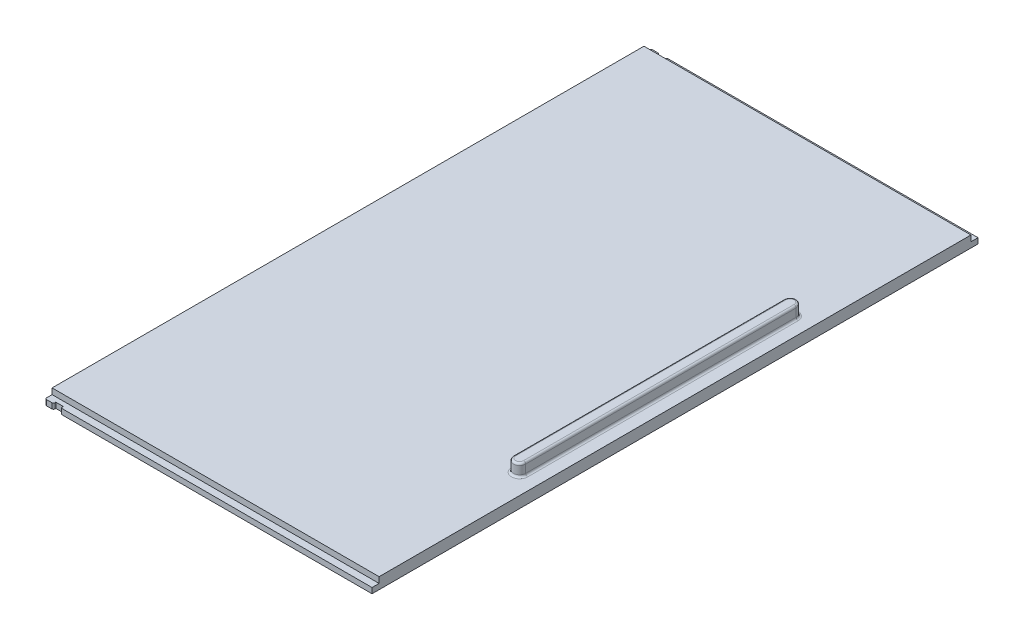
ISO-10303-21;
HEADER;
FILE_DESCRIPTION(('STEP AP214'),'2;1');
FILE_NAME('part.step','',(''),(''),'','','');
FILE_SCHEMA(('AUTOMOTIVE_DESIGN { 1 0 10303 214 1 1 1 1 }'));
ENDSEC;
DATA;
#1=APPLICATION_CONTEXT('core data for automotive mechanical design processes');
#2=APPLICATION_PROTOCOL_DEFINITION('international standard','automotive_design',2000,#1);
#3=PRODUCT_CONTEXT('',#1,'mechanical');
#4=PRODUCT('Part','Part','',(#3));
#5=PRODUCT_RELATED_PRODUCT_CATEGORY('part','',(#4));
#6=PRODUCT_DEFINITION_FORMATION('','',#4);
#7=PRODUCT_DEFINITION_CONTEXT('part definition',#1,'design');
#8=PRODUCT_DEFINITION('design','',#6,#7);
#9=PRODUCT_DEFINITION_SHAPE('','',#8);
#10=(LENGTH_UNIT() NAMED_UNIT(*) SI_UNIT(.MILLI.,.METRE.));
#11=(NAMED_UNIT(*) PLANE_ANGLE_UNIT() SI_UNIT($,.RADIAN.));
#12=(NAMED_UNIT(*) SI_UNIT($,.STERADIAN.) SOLID_ANGLE_UNIT());
#13=UNCERTAINTY_MEASURE_WITH_UNIT(LENGTH_MEASURE(1.E-05),#10,'distance_accuracy_value','');
#14=(GEOMETRIC_REPRESENTATION_CONTEXT(3) GLOBAL_UNCERTAINTY_ASSIGNED_CONTEXT((#13)) GLOBAL_UNIT_ASSIGNED_CONTEXT((#10,
#11,#12)) REPRESENTATION_CONTEXT('',''));
#15=CARTESIAN_POINT('',(0.,0.,0.));
#16=DIRECTION('',(0.,0.,1.));
#17=DIRECTION('',(1.,0.,0.));
#18=AXIS2_PLACEMENT_3D('',#15,#16,#17);
#19=CARTESIAN_POINT('',(0.,3.,0.));
#20=DIRECTION('',(0.,-1.,0.));
#21=DIRECTION('',(0.,0.,-1.));
#22=AXIS2_PLACEMENT_3D('',#19,#20,#21);
#23=PLANE('',#22);
#24=CARTESIAN_POINT('',(76.,3.,-43.));
#25=DIRECTION('',(0.,-1.,0.));
#26=DIRECTION('',(0.,0.,-1.));
#27=AXIS2_PLACEMENT_3D('',#24,#25,#26);
#28=CIRCLE('',#27,2.);
#29=CARTESIAN_POINT('',(78.,3.,-43.));
#30=VERTEX_POINT('',#29);
#31=CARTESIAN_POINT('',(74.,3.,-43.));
#32=VERTEX_POINT('',#31);
#33=EDGE_CURVE('E346',#30,#32,#28,.T.);
#34=ORIENTED_EDGE('',*,*,#33,.T.);
#35=DIRECTION('',(0.,0.,1.));
#36=VECTOR('',#35,1.);
#37=CARTESIAN_POINT('',(74.,3.,-110.));
#38=LINE('',#37,#36);
#39=CARTESIAN_POINT('',(74.,3.,-110.));
#40=VERTEX_POINT('',#39);
#41=EDGE_CURVE('E352',#32,#40,#38,.F.);
#42=ORIENTED_EDGE('',*,*,#41,.T.);
#43=CARTESIAN_POINT('',(76.,3.,-110.));
#44=DIRECTION('',(0.,-1.,0.));
#45=DIRECTION('',(0.,0.,-1.));
#46=AXIS2_PLACEMENT_3D('',#43,#44,#45);
#47=CIRCLE('',#46,2.);
#48=CARTESIAN_POINT('',(78.,3.,-110.));
#49=VERTEX_POINT('',#48);
#50=EDGE_CURVE('E350',#40,#49,#47,.T.);
#51=ORIENTED_EDGE('',*,*,#50,.T.);
#52=DIRECTION('',(0.,0.,-1.));
#53=VECTOR('',#52,1.);
#54=CARTESIAN_POINT('',(78.,3.,-43.));
#55=LINE('',#54,#53);
#56=EDGE_CURVE('E348',#49,#30,#55,.F.);
#57=ORIENTED_EDGE('',*,*,#56,.T.);
#58=EDGE_LOOP('',(#34,#42,#51,#57));
#59=FACE_BOUND('',#58,.T.);
#60=DIRECTION('',(0.,0.,1.));
#61=VECTOR('',#60,1.);
#62=CARTESIAN_POINT('',(0.,3.,0.));
#63=LINE('',#62,#61);
#64=CARTESIAN_POINT('',(0.,3.00000000000002,-149.8));
#65=VERTEX_POINT('',#64);
#66=CARTESIAN_POINT('',(0.,3.,-3.2));
#67=VERTEX_POINT('',#66);
#68=EDGE_CURVE('E284',#65,#67,#63,.T.);
#69=ORIENTED_EDGE('',*,*,#68,.T.);
#70=DIRECTION('',(1.,0.,0.));
#71=VECTOR('',#70,1.);
#72=CARTESIAN_POINT('',(-3.57805813256296,3.,-3.2));
#73=LINE('',#72,#71);
#74=CARTESIAN_POINT('',(81.,3.,-3.2));
#75=VERTEX_POINT('',#74);
#76=EDGE_CURVE('E469',#67,#75,#73,.T.);
#77=ORIENTED_EDGE('',*,*,#76,.T.);
#78=DIRECTION('',(0.,0.,-1.));
#79=VECTOR('',#78,1.);
#80=CARTESIAN_POINT('',(81.,3.,0.));
#81=LINE('',#80,#79);
#82=CARTESIAN_POINT('',(81.,3.00000000000002,-149.8));
#83=VERTEX_POINT('',#82);
#84=EDGE_CURVE('E287',#75,#83,#81,.T.);
#85=ORIENTED_EDGE('',*,*,#84,.T.);
#86=DIRECTION('',(1.,0.,0.));
#87=VECTOR('',#86,1.);
#88=CARTESIAN_POINT('',(-3.57805813256296,3.00000000000002,-149.8));
#89=LINE('',#88,#87);
#90=EDGE_CURVE('E267',#65,#83,#89,.T.);
#91=ORIENTED_EDGE('',*,*,#90,.F.);
#92=EDGE_LOOP('',(#69,#77,#85,#91));
#93=FACE_BOUND('',#92,.T.);
#94=ADVANCED_FACE('F41',(#59,#93),#23,.F.);
#95=CARTESIAN_POINT('',(-3.57805813256296,0.,-151.55));
#96=DIRECTION('',(0.,0.,1.));
#97=DIRECTION('',(1.,0.,0.));
#98=AXIS2_PLACEMENT_3D('',#95,#96,#97);
#99=PLANE('',#98);
#100=DIRECTION('',(1.,0.,0.));
#101=VECTOR('',#100,1.);
#102=CARTESIAN_POINT('',(0.,0.2,-151.55));
#103=LINE('',#102,#101);
#104=CARTESIAN_POINT('',(4.12500000000001,0.2,-151.55));
#105=VERTEX_POINT('',#104);
#106=CARTESIAN_POINT('',(81.,0.2,-151.55));
#107=VERTEX_POINT('',#106);
#108=EDGE_CURVE('E238',#105,#107,#103,.T.);
#109=ORIENTED_EDGE('',*,*,#108,.F.);
#110=DIRECTION('',(0.,1.,0.));
#111=VECTOR('',#110,1.);
#112=CARTESIAN_POINT('',(4.12500000000001,0.,-151.55));
#113=LINE('',#112,#111);
#114=CARTESIAN_POINT('',(4.12500000000001,1.55000000000002,-151.55));
#115=VERTEX_POINT('',#114);
#116=EDGE_CURVE('E317',#105,#115,#113,.T.);
#117=ORIENTED_EDGE('',*,*,#116,.T.);
#118=DIRECTION('',(1.,0.,0.));
#119=VECTOR('',#118,1.);
#120=CARTESIAN_POINT('',(-3.57805813256296,1.55000000000002,-151.55));
#121=LINE('',#120,#119);
#122=CARTESIAN_POINT('',(81.,1.55000000000002,-151.55));
#123=VERTEX_POINT('',#122);
#124=EDGE_CURVE('E264',#115,#123,#121,.T.);
#125=ORIENTED_EDGE('',*,*,#124,.T.);
#126=DIRECTION('',(0.,-1.,0.));
#127=VECTOR('',#126,1.);
#128=CARTESIAN_POINT('',(81.,0.,-151.55));
#129=LINE('',#128,#127);
#130=EDGE_CURVE('E257',#123,#107,#129,.T.);
#131=ORIENTED_EDGE('',*,*,#130,.T.);
#132=EDGE_LOOP('',(#109,#117,#125,#131));
#133=FACE_BOUND('',#132,.T.);
#134=ADVANCED_FACE('F262',(#133),#99,.F.);
#135=CARTESIAN_POINT('',(-3.57805813256296,0.,-1.45));
#136=DIRECTION('',(0.,0.,-1.));
#137=DIRECTION('',(0.,1.,0.));
#138=AXIS2_PLACEMENT_3D('',#135,#136,#137);
#139=PLANE('',#138);
#140=DIRECTION('',(-1.,0.,0.));
#141=VECTOR('',#140,1.);
#142=CARTESIAN_POINT('',(0.,0.2,-1.45));
#143=LINE('',#142,#141);
#144=CARTESIAN_POINT('',(81.,0.2,-1.45));
#145=VERTEX_POINT('',#144);
#146=CARTESIAN_POINT('',(4.125,0.2,-1.45));
#147=VERTEX_POINT('',#146);
#148=EDGE_CURVE('E416',#145,#147,#143,.T.);
#149=ORIENTED_EDGE('',*,*,#148,.F.);
#150=DIRECTION('',(0.,1.,0.));
#151=VECTOR('',#150,1.);
#152=CARTESIAN_POINT('',(81.,0.,-1.45));
#153=LINE('',#152,#151);
#154=CARTESIAN_POINT('',(81.,1.55,-1.45));
#155=VERTEX_POINT('',#154);
#156=EDGE_CURVE('E259',#145,#155,#153,.T.);
#157=ORIENTED_EDGE('',*,*,#156,.T.);
#158=DIRECTION('',(1.,0.,0.));
#159=VECTOR('',#158,1.);
#160=CARTESIAN_POINT('',(-3.57805813256296,1.55,-1.45));
#161=LINE('',#160,#159);
#162=CARTESIAN_POINT('',(4.125,1.55,-1.45));
#163=VERTEX_POINT('',#162);
#164=EDGE_CURVE('E477',#163,#155,#161,.T.);
#165=ORIENTED_EDGE('',*,*,#164,.F.);
#166=DIRECTION('',(0.,-1.,0.));
#167=VECTOR('',#166,1.);
#168=CARTESIAN_POINT('',(4.125,0.,-1.45));
#169=LINE('',#168,#167);
#170=EDGE_CURVE('E303',#163,#147,#169,.T.);
#171=ORIENTED_EDGE('',*,*,#170,.T.);
#172=EDGE_LOOP('',(#149,#157,#165,#171));
#173=FACE_BOUND('',#172,.T.);
#174=ADVANCED_FACE('F568',(#173),#139,.F.);
#175=CARTESIAN_POINT('',(0.,3.,0.));
#176=DIRECTION('',(1.,0.,0.));
#177=DIRECTION('',(0.,0.,-1.));
#178=AXIS2_PLACEMENT_3D('',#175,#176,#177);
#179=PLANE('',#178);
#180=DIRECTION('',(0.,0.,1.));
#181=VECTOR('',#180,1.);
#182=CARTESIAN_POINT('',(0.,1.55000000000002,-151.55));
#183=LINE('',#182,#181);
#184=CARTESIAN_POINT('',(0.,1.55000000000002,-151.15));
#185=VERTEX_POINT('',#184);
#186=CARTESIAN_POINT('',(0.,1.55000000000002,-149.8));
#187=VERTEX_POINT('',#186);
#188=EDGE_CURVE('E279',#185,#187,#183,.T.);
#189=ORIENTED_EDGE('',*,*,#188,.F.);
#190=DIRECTION('',(0.,1.,0.));
#191=VECTOR('',#190,1.);
#192=CARTESIAN_POINT('',(0.,3.,-151.15));
#193=LINE('',#192,#191);
#194=CARTESIAN_POINT('',(0.,0.2,-151.15));
#195=VERTEX_POINT('',#194);
#196=EDGE_CURVE('E329',#185,#195,#193,.F.);
#197=ORIENTED_EDGE('',*,*,#196,.T.);
#198=DIRECTION('',(0.,0.,-1.));
#199=VECTOR('',#198,1.);
#200=CARTESIAN_POINT('',(0.,0.2,-1.45));
#201=LINE('',#200,#199);
#202=CARTESIAN_POINT('',(0.,0.2,-1.85));
#203=VERTEX_POINT('',#202);
#204=EDGE_CURVE('E250',#203,#195,#201,.T.);
#205=ORIENTED_EDGE('',*,*,#204,.F.);
#206=DIRECTION('',(0.,-1.,0.));
#207=VECTOR('',#206,1.);
#208=CARTESIAN_POINT('',(0.,3.,-1.85));
#209=LINE('',#208,#207);
#210=CARTESIAN_POINT('',(0.,1.55,-1.85));
#211=VERTEX_POINT('',#210);
#212=EDGE_CURVE('E327',#203,#211,#209,.F.);
#213=ORIENTED_EDGE('',*,*,#212,.T.);
#214=DIRECTION('',(0.,0.,1.));
#215=VECTOR('',#214,1.);
#216=CARTESIAN_POINT('',(0.,1.55,-1.45));
#217=LINE('',#216,#215);
#218=CARTESIAN_POINT('',(0.,1.55,-3.2));
#219=VERTEX_POINT('',#218);
#220=EDGE_CURVE('E466',#219,#211,#217,.T.);
#221=ORIENTED_EDGE('',*,*,#220,.F.);
#222=DIRECTION('',(0.,-1.,0.));
#223=VECTOR('',#222,1.);
#224=CARTESIAN_POINT('',(0.,1.55,-3.2));
#225=LINE('',#224,#223);
#226=EDGE_CURVE('E288',#67,#219,#225,.T.);
#227=ORIENTED_EDGE('',*,*,#226,.F.);
#228=ORIENTED_EDGE('',*,*,#68,.F.);
#229=DIRECTION('',(0.,1.,0.));
#230=VECTOR('',#229,1.);
#231=CARTESIAN_POINT('',(0.,1.55000000000002,-149.8));
#232=LINE('',#231,#230);
#233=EDGE_CURVE('E281',#187,#65,#232,.T.);
#234=ORIENTED_EDGE('',*,*,#233,.F.);
#235=EDGE_LOOP('',(#189,#197,#205,#213,#221,#227,#228,#234));
#236=FACE_BOUND('',#235,.T.);
#237=ADVANCED_FACE('F527',(#236),#179,.F.);
#238=CARTESIAN_POINT('',(81.,3.,0.));
#239=DIRECTION('',(-1.,0.,0.));
#240=DIRECTION('',(0.,0.,1.));
#241=AXIS2_PLACEMENT_3D('',#238,#239,#240);
#242=PLANE('',#241);
#243=DIRECTION('',(0.,0.,1.));
#244=VECTOR('',#243,1.);
#245=CARTESIAN_POINT('',(81.,0.2,-1.45));
#246=LINE('',#245,#244);
#247=EDGE_CURVE('E242',#107,#145,#246,.T.);
#248=ORIENTED_EDGE('',*,*,#247,.F.);
#249=ORIENTED_EDGE('',*,*,#130,.F.);
#250=DIRECTION('',(0.,0.,-1.));
#251=VECTOR('',#250,1.);
#252=CARTESIAN_POINT('',(81.,1.55000000000002,-151.55));
#253=LINE('',#252,#251);
#254=CARTESIAN_POINT('',(81.,1.55000000000002,-149.8));
#255=VERTEX_POINT('',#254);
#256=EDGE_CURVE('E266',#255,#123,#253,.T.);
#257=ORIENTED_EDGE('',*,*,#256,.F.);
#258=DIRECTION('',(0.,-1.,0.));
#259=VECTOR('',#258,1.);
#260=CARTESIAN_POINT('',(81.,1.55000000000002,-149.8));
#261=LINE('',#260,#259);
#262=EDGE_CURVE('E269',#83,#255,#261,.T.);
#263=ORIENTED_EDGE('',*,*,#262,.F.);
#264=ORIENTED_EDGE('',*,*,#84,.F.);
#265=DIRECTION('',(0.,1.,0.));
#266=VECTOR('',#265,1.);
#267=CARTESIAN_POINT('',(81.,1.55,-3.2));
#268=LINE('',#267,#266);
#269=CARTESIAN_POINT('',(81.,1.55,-3.2));
#270=VERTEX_POINT('',#269);
#271=EDGE_CURVE('E475',#270,#75,#268,.T.);
#272=ORIENTED_EDGE('',*,*,#271,.F.);
#273=DIRECTION('',(0.,0.,-1.));
#274=VECTOR('',#273,1.);
#275=CARTESIAN_POINT('',(81.,1.55,-1.45));
#276=LINE('',#275,#274);
#277=EDGE_CURVE('E472',#155,#270,#276,.T.);
#278=ORIENTED_EDGE('',*,*,#277,.F.);
#279=ORIENTED_EDGE('',*,*,#156,.F.);
#280=EDGE_LOOP('',(#248,#249,#257,#263,#264,#272,#278,#279));
#281=FACE_BOUND('',#280,.T.);
#282=ADVANCED_FACE('F255',(#281),#242,.F.);
#283=CARTESIAN_POINT('',(0.4,0.2,-151.55));
#284=VERTEX_POINT('',#283);
#285=CARTESIAN_POINT('',(1.675,0.2,-151.55));
#286=VERTEX_POINT('',#285);
#287=EDGE_CURVE('E249',#284,#286,#103,.T.);
#288=ORIENTED_EDGE('',*,*,#287,.F.);
#289=DIRECTION('',(0.,1.,0.));
#290=VECTOR('',#289,1.);
#291=CARTESIAN_POINT('',(0.4,0.,-151.55));
#292=LINE('',#291,#290);
#293=CARTESIAN_POINT('',(0.4,1.55000000000002,-151.55));
#294=VERTEX_POINT('',#293);
#295=EDGE_CURVE('E322',#284,#294,#292,.T.);
#296=ORIENTED_EDGE('',*,*,#295,.T.);
#297=CARTESIAN_POINT('',(1.675,1.55000000000002,-151.55));
#298=VERTEX_POINT('',#297);
#299=EDGE_CURVE('E274',#294,#298,#121,.T.);
#300=ORIENTED_EDGE('',*,*,#299,.T.);
#301=DIRECTION('',(0.,1.,0.));
#302=VECTOR('',#301,1.);
#303=CARTESIAN_POINT('',(1.675,0.,-151.55));
#304=LINE('',#303,#302);
#305=EDGE_CURVE('E311',#298,#286,#304,.F.);
#306=ORIENTED_EDGE('',*,*,#305,.T.);
#307=EDGE_LOOP('',(#288,#296,#300,#306));
#308=FACE_BOUND('',#307,.T.);
#309=ADVANCED_FACE('F488',(#308),#99,.F.);
#310=CARTESIAN_POINT('',(0.4,1.55,-1.45));
#311=VERTEX_POINT('',#310);
#312=CARTESIAN_POINT('',(1.675,1.55,-1.45));
#313=VERTEX_POINT('',#312);
#314=EDGE_CURVE('E482',#311,#313,#161,.T.);
#315=ORIENTED_EDGE('',*,*,#314,.F.);
#316=DIRECTION('',(0.,-1.,0.));
#317=VECTOR('',#316,1.);
#318=CARTESIAN_POINT('',(0.4,0.,-1.45));
#319=LINE('',#318,#317);
#320=CARTESIAN_POINT('',(0.4,0.2,-1.45));
#321=VERTEX_POINT('',#320);
#322=EDGE_CURVE('E335',#311,#321,#319,.T.);
#323=ORIENTED_EDGE('',*,*,#322,.T.);
#324=CARTESIAN_POINT('',(1.675,0.2,-1.45));
#325=VERTEX_POINT('',#324);
#326=EDGE_CURVE('E260',#325,#321,#143,.T.);
#327=ORIENTED_EDGE('',*,*,#326,.F.);
#328=DIRECTION('',(0.,-1.,0.));
#329=VECTOR('',#328,1.);
#330=CARTESIAN_POINT('',(1.675,0.,-1.45));
#331=LINE('',#330,#329);
#332=EDGE_CURVE('E294',#325,#313,#331,.F.);
#333=ORIENTED_EDGE('',*,*,#332,.T.);
#334=EDGE_LOOP('',(#315,#323,#327,#333));
#335=FACE_BOUND('',#334,.T.);
#336=ADVANCED_FACE('F541',(#335),#139,.F.);
#337=CARTESIAN_POINT('',(3.925,0.,-2.05));
#338=DIRECTION('',(1.,0.,0.));
#339=DIRECTION('',(0.,0.,-1.));
#340=AXIS2_PLACEMENT_3D('',#337,#338,#339);
#341=PLANE('',#340);
#342=DIRECTION('',(0.,0.,-1.));
#343=VECTOR('',#342,1.);
#344=CARTESIAN_POINT('',(3.925,0.2,-2.05));
#345=LINE('',#344,#343);
#346=CARTESIAN_POINT('',(3.925,0.2,-1.64999999999999));
#347=VERTEX_POINT('',#346);
#348=CARTESIAN_POINT('',(3.925,0.2,-2.05));
#349=VERTEX_POINT('',#348);
#350=EDGE_CURVE('E430',#347,#349,#345,.T.);
#351=ORIENTED_EDGE('',*,*,#350,.F.);
#352=DIRECTION('',(0.,1.,0.));
#353=VECTOR('',#352,1.);
#354=CARTESIAN_POINT('',(3.925,0.,-1.64999999999999));
#355=LINE('',#354,#353);
#356=CARTESIAN_POINT('',(3.925,1.55,-1.64999999999999));
#357=VERTEX_POINT('',#356);
#358=EDGE_CURVE('E299',#347,#357,#355,.T.);
#359=ORIENTED_EDGE('',*,*,#358,.T.);
#360=DIRECTION('',(0.,0.,1.));
#361=VECTOR('',#360,1.);
#362=CARTESIAN_POINT('',(3.925,1.55,-2.05));
#363=LINE('',#362,#361);
#364=CARTESIAN_POINT('',(3.925,1.55,-2.05));
#365=VERTEX_POINT('',#364);
#366=EDGE_CURVE('E461',#365,#357,#363,.T.);
#367=ORIENTED_EDGE('',*,*,#366,.F.);
#368=DIRECTION('',(0.,1.,0.));
#369=VECTOR('',#368,1.);
#370=CARTESIAN_POINT('',(3.925,0.,-2.05));
#371=LINE('',#370,#369);
#372=EDGE_CURVE('E451',#349,#365,#371,.T.);
#373=ORIENTED_EDGE('',*,*,#372,.F.);
#374=EDGE_LOOP('',(#351,#359,#367,#373));
#375=FACE_BOUND('',#374,.T.);
#376=ADVANCED_FACE('F559',(#375),#341,.F.);
#377=CARTESIAN_POINT('',(2.075,0.,-2.05));
#378=DIRECTION('',(-1.,0.,0.));
#379=DIRECTION('',(0.,0.,1.));
#380=AXIS2_PLACEMENT_3D('',#377,#378,#379);
#381=PLANE('',#380);
#382=DIRECTION('',(0.,0.,1.));
#383=VECTOR('',#382,1.);
#384=CARTESIAN_POINT('',(2.075,0.2,-2.05));
#385=LINE('',#384,#383);
#386=CARTESIAN_POINT('',(2.075,0.2,-2.05));
#387=VERTEX_POINT('',#386);
#388=CARTESIAN_POINT('',(2.075,0.2,-1.85));
#389=VERTEX_POINT('',#388);
#390=EDGE_CURVE('E434',#387,#389,#385,.T.);
#391=ORIENTED_EDGE('',*,*,#390,.F.);
#392=DIRECTION('',(0.,-1.,0.));
#393=VECTOR('',#392,1.);
#394=CARTESIAN_POINT('',(2.075,0.,-2.05));
#395=LINE('',#394,#393);
#396=CARTESIAN_POINT('',(2.075,1.55,-2.05));
#397=VERTEX_POINT('',#396);
#398=EDGE_CURVE('E458',#397,#387,#395,.T.);
#399=ORIENTED_EDGE('',*,*,#398,.F.);
#400=DIRECTION('',(0.,0.,1.));
#401=VECTOR('',#400,1.);
#402=CARTESIAN_POINT('',(2.075,1.55,-2.05));
#403=LINE('',#402,#401);
#404=CARTESIAN_POINT('',(2.075,1.55,-1.85));
#405=VERTEX_POINT('',#404);
#406=EDGE_CURVE('E282',#397,#405,#403,.T.);
#407=ORIENTED_EDGE('',*,*,#406,.T.);
#408=DIRECTION('',(0.,-1.,0.));
#409=VECTOR('',#408,1.);
#410=CARTESIAN_POINT('',(2.075,0.,-1.85));
#411=LINE('',#410,#409);
#412=EDGE_CURVE('E291',#405,#389,#411,.T.);
#413=ORIENTED_EDGE('',*,*,#412,.T.);
#414=EDGE_LOOP('',(#391,#399,#407,#413));
#415=FACE_BOUND('',#414,.T.);
#416=ADVANCED_FACE('F549',(#415),#381,.F.);
#417=CARTESIAN_POINT('',(0.,0.,-2.05));
#418=DIRECTION('',(0.,0.,-1.));
#419=DIRECTION('',(-1.,0.,0.));
#420=AXIS2_PLACEMENT_3D('',#417,#418,#419);
#421=PLANE('',#420);
#422=DIRECTION('',(-1.,0.,0.));
#423=VECTOR('',#422,1.);
#424=CARTESIAN_POINT('',(0.,0.2,-2.05));
#425=LINE('',#424,#423);
#426=EDGE_CURVE('E432',#349,#387,#425,.T.);
#427=ORIENTED_EDGE('',*,*,#426,.F.);
#428=ORIENTED_EDGE('',*,*,#372,.T.);
#429=DIRECTION('',(-1.,0.,0.));
#430=VECTOR('',#429,1.);
#431=CARTESIAN_POINT('',(2.075,1.55,-2.05));
#432=LINE('',#431,#430);
#433=EDGE_CURVE('E455',#365,#397,#432,.T.);
#434=ORIENTED_EDGE('',*,*,#433,.T.);
#435=ORIENTED_EDGE('',*,*,#398,.T.);
#436=EDGE_LOOP('',(#427,#428,#434,#435));
#437=FACE_BOUND('',#436,.T.);
#438=ADVANCED_FACE('F555',(#437),#421,.F.);
#439=CARTESIAN_POINT('',(1.675,0.,-1.85));
#440=DIRECTION('',(0.,-1.,0.));
#441=DIRECTION('',(0.,0.,-1.));
#442=AXIS2_PLACEMENT_3D('',#439,#440,#441);
#443=CYLINDRICAL_SURFACE('',#442,0.4);
#444=ORIENTED_EDGE('',*,*,#332,.F.);
#445=CARTESIAN_POINT('',(1.675,0.2,-1.85));
#446=DIRECTION('',(0.,-1.,0.));
#447=DIRECTION('',(0.,0.,-1.));
#448=AXIS2_PLACEMENT_3D('',#445,#446,#447);
#449=CIRCLE('',#448,0.4);
#450=EDGE_CURVE('E436',#325,#389,#449,.F.);
#451=ORIENTED_EDGE('',*,*,#450,.T.);
#452=ORIENTED_EDGE('',*,*,#412,.F.);
#453=CARTESIAN_POINT('',(1.675,1.55,-1.85));
#454=DIRECTION('',(0.,-1.,0.));
#455=DIRECTION('',(0.,0.,-1.));
#456=AXIS2_PLACEMENT_3D('',#453,#454,#455);
#457=CIRCLE('',#456,0.4);
#458=EDGE_CURVE('E297',#313,#405,#457,.F.);
#459=ORIENTED_EDGE('',*,*,#458,.F.);
#460=EDGE_LOOP('',(#444,#451,#452,#459));
#461=FACE_BOUND('',#460,.T.);
#462=ADVANCED_FACE('F546',(#461),#443,.T.);
#463=CARTESIAN_POINT('',(3.925,0.,-1.64999999999999));
#464=DIRECTION('',(0.707106781186523,0.,-0.707106781186572));
#465=DIRECTION('',(0.,1.,0.));
#466=AXIS2_PLACEMENT_3D('',#463,#464,#465);
#467=PLANE('',#466);
#468=ORIENTED_EDGE('',*,*,#358,.F.);
#469=DIRECTION('',(-0.707106781186572,0.,-0.707106781186523));
#470=VECTOR('',#469,1.);
#471=CARTESIAN_POINT('',(3.925,0.2,-1.64999999999999));
#472=LINE('',#471,#470);
#473=EDGE_CURVE('E427',#347,#147,#472,.F.);
#474=ORIENTED_EDGE('',*,*,#473,.T.);
#475=ORIENTED_EDGE('',*,*,#170,.F.);
#476=DIRECTION('',(-0.707106781186572,0.,-0.707106781186523));
#477=VECTOR('',#476,1.);
#478=CARTESIAN_POINT('',(3.925,1.55,-1.64999999999999));
#479=LINE('',#478,#477);
#480=EDGE_CURVE('E301',#357,#163,#479,.F.);
#481=ORIENTED_EDGE('',*,*,#480,.F.);
#482=EDGE_LOOP('',(#468,#474,#475,#481));
#483=FACE_BOUND('',#482,.T.);
#484=ADVANCED_FACE('F564',(#483),#467,.F.);
#485=CARTESIAN_POINT('',(3.925,1.55,-150.95));
#486=DIRECTION('',(1.,0.,0.));
#487=DIRECTION('',(0.,0.,-1.));
#488=AXIS2_PLACEMENT_3D('',#485,#486,#487);
#489=PLANE('',#488);
#490=DIRECTION('',(0.,0.,-1.));
#491=VECTOR('',#490,1.);
#492=CARTESIAN_POINT('',(3.925,0.2,-150.95));
#493=LINE('',#492,#491);
#494=CARTESIAN_POINT('',(3.925,0.2,-150.95));
#495=VERTEX_POINT('',#494);
#496=CARTESIAN_POINT('',(3.925,0.2,-151.35));
#497=VERTEX_POINT('',#496);
#498=EDGE_CURVE('E418',#495,#497,#493,.T.);
#499=ORIENTED_EDGE('',*,*,#498,.F.);
#500=DIRECTION('',(0.,-1.,0.));
#501=VECTOR('',#500,1.);
#502=CARTESIAN_POINT('',(3.925,1.55,-150.95));
#503=LINE('',#502,#501);
#504=CARTESIAN_POINT('',(3.925,1.55,-150.95));
#505=VERTEX_POINT('',#504);
#506=EDGE_CURVE('E439',#505,#495,#503,.T.);
#507=ORIENTED_EDGE('',*,*,#506,.F.);
#508=DIRECTION('',(0.,0.,-1.));
#509=VECTOR('',#508,1.);
#510=CARTESIAN_POINT('',(3.925,1.55,-150.95));
#511=LINE('',#510,#509);
#512=CARTESIAN_POINT('',(3.925,1.55,-151.35));
#513=VERTEX_POINT('',#512);
#514=EDGE_CURVE('E448',#505,#513,#511,.T.);
#515=ORIENTED_EDGE('',*,*,#514,.T.);
#516=DIRECTION('',(0.,-1.,0.));
#517=VECTOR('',#516,1.);
#518=CARTESIAN_POINT('',(3.925,1.55,-151.35));
#519=LINE('',#518,#517);
#520=EDGE_CURVE('E314',#513,#497,#519,.T.);
#521=ORIENTED_EDGE('',*,*,#520,.T.);
#522=EDGE_LOOP('',(#499,#507,#515,#521));
#523=FACE_BOUND('',#522,.T.);
#524=ADVANCED_FACE('F508',(#523),#489,.F.);
#525=CARTESIAN_POINT('',(2.075,1.55,-150.95));
#526=DIRECTION('',(-1.,0.,0.));
#527=DIRECTION('',(0.,0.,1.));
#528=AXIS2_PLACEMENT_3D('',#525,#526,#527);
#529=PLANE('',#528);
#530=DIRECTION('',(0.,0.,1.));
#531=VECTOR('',#530,1.);
#532=CARTESIAN_POINT('',(2.075,0.2,-150.95));
#533=LINE('',#532,#531);
#534=CARTESIAN_POINT('',(2.075,0.2,-151.15));
#535=VERTEX_POINT('',#534);
#536=CARTESIAN_POINT('',(2.075,0.2,-150.95));
#537=VERTEX_POINT('',#536);
#538=EDGE_CURVE('E422',#535,#537,#533,.T.);
#539=ORIENTED_EDGE('',*,*,#538,.F.);
#540=DIRECTION('',(0.,1.,0.));
#541=VECTOR('',#540,1.);
#542=CARTESIAN_POINT('',(2.075,1.55,-151.15));
#543=LINE('',#542,#541);
#544=CARTESIAN_POINT('',(2.075,1.55,-151.15));
#545=VERTEX_POINT('',#544);
#546=EDGE_CURVE('E306',#535,#545,#543,.T.);
#547=ORIENTED_EDGE('',*,*,#546,.T.);
#548=DIRECTION('',(0.,0.,-1.));
#549=VECTOR('',#548,1.);
#550=CARTESIAN_POINT('',(2.075,1.55,-150.95));
#551=LINE('',#550,#549);
#552=CARTESIAN_POINT('',(2.075,1.55000000000002,-150.95));
#553=VERTEX_POINT('',#552);
#554=EDGE_CURVE('E447',#553,#545,#551,.T.);
#555=ORIENTED_EDGE('',*,*,#554,.F.);
#556=DIRECTION('',(0.,1.,0.));
#557=VECTOR('',#556,1.);
#558=CARTESIAN_POINT('',(2.075,1.55,-150.95));
#559=LINE('',#558,#557);
#560=EDGE_CURVE('E442',#537,#553,#559,.T.);
#561=ORIENTED_EDGE('',*,*,#560,.F.);
#562=EDGE_LOOP('',(#539,#547,#555,#561));
#563=FACE_BOUND('',#562,.T.);
#564=ADVANCED_FACE('F502',(#563),#529,.F.);
#565=CARTESIAN_POINT('',(0.,0.,-150.95));
#566=DIRECTION('',(0.,0.,1.));
#567=DIRECTION('',(1.,0.,0.));
#568=AXIS2_PLACEMENT_3D('',#565,#566,#567);
#569=PLANE('',#568);
#570=DIRECTION('',(1.,0.,0.));
#571=VECTOR('',#570,1.);
#572=CARTESIAN_POINT('',(0.,0.2,-150.95));
#573=LINE('',#572,#571);
#574=EDGE_CURVE('E420',#537,#495,#573,.T.);
#575=ORIENTED_EDGE('',*,*,#574,.F.);
#576=ORIENTED_EDGE('',*,*,#560,.T.);
#577=DIRECTION('',(1.,0.,0.));
#578=VECTOR('',#577,1.);
#579=CARTESIAN_POINT('',(2.075,1.55,-150.95));
#580=LINE('',#579,#578);
#581=EDGE_CURVE('E444',#553,#505,#580,.T.);
#582=ORIENTED_EDGE('',*,*,#581,.T.);
#583=ORIENTED_EDGE('',*,*,#506,.T.);
#584=EDGE_LOOP('',(#575,#576,#582,#583));
#585=FACE_BOUND('',#584,.T.);
#586=ADVANCED_FACE('F504',(#585),#569,.F.);
#587=CARTESIAN_POINT('',(1.675,1.55,-151.15));
#588=DIRECTION('',(0.,1.,0.));
#589=DIRECTION('',(0.,0.,1.));
#590=AXIS2_PLACEMENT_3D('',#587,#588,#589);
#591=CYLINDRICAL_SURFACE('',#590,0.4);
#592=ORIENTED_EDGE('',*,*,#546,.F.);
#593=CARTESIAN_POINT('',(1.675,0.2,-151.15));
#594=DIRECTION('',(0.,-1.,0.));
#595=DIRECTION('',(0.,0.,-1.));
#596=AXIS2_PLACEMENT_3D('',#593,#594,#595);
#597=CIRCLE('',#596,0.4);
#598=EDGE_CURVE('E424',#535,#286,#597,.F.);
#599=ORIENTED_EDGE('',*,*,#598,.T.);
#600=ORIENTED_EDGE('',*,*,#305,.F.);
#601=CARTESIAN_POINT('',(1.675,1.55000000000002,-151.15));
#602=DIRECTION('',(0.,-1.,0.));
#603=DIRECTION('',(0.,0.,-1.));
#604=AXIS2_PLACEMENT_3D('',#601,#602,#603);
#605=CIRCLE('',#604,0.4);
#606=EDGE_CURVE('E308',#545,#298,#605,.F.);
#607=ORIENTED_EDGE('',*,*,#606,.F.);
#608=EDGE_LOOP('',(#592,#599,#600,#607));
#609=FACE_BOUND('',#608,.T.);
#610=ADVANCED_FACE('F497',(#609),#591,.T.);
#611=CARTESIAN_POINT('',(3.925,1.55,-151.35));
#612=DIRECTION('',(0.707106781186548,0.,0.707106781186548));
#613=DIRECTION('',(0.,-1.,0.));
#614=AXIS2_PLACEMENT_3D('',#611,#612,#613);
#615=PLANE('',#614);
#616=ORIENTED_EDGE('',*,*,#116,.F.);
#617=DIRECTION('',(0.707106781186548,0.,-0.707106781186548));
#618=VECTOR('',#617,1.);
#619=CARTESIAN_POINT('',(3.925,0.2,-151.35));
#620=LINE('',#619,#618);
#621=EDGE_CURVE('E245',#105,#497,#620,.F.);
#622=ORIENTED_EDGE('',*,*,#621,.T.);
#623=ORIENTED_EDGE('',*,*,#520,.F.);
#624=DIRECTION('',(0.707106781186548,0.,-0.707106781186548));
#625=VECTOR('',#624,1.);
#626=CARTESIAN_POINT('',(3.925,1.55000000000002,-151.35));
#627=LINE('',#626,#625);
#628=EDGE_CURVE('E319',#115,#513,#627,.F.);
#629=ORIENTED_EDGE('',*,*,#628,.F.);
#630=EDGE_LOOP('',(#616,#622,#623,#629));
#631=FACE_BOUND('',#630,.T.);
#632=ADVANCED_FACE('F512',(#631),#615,.F.);
#633=CARTESIAN_POINT('',(-3.57805813256296,1.55000000000002,-151.55));
#634=DIRECTION('',(0.,-1.,0.));
#635=DIRECTION('',(0.,0.,-1.));
#636=AXIS2_PLACEMENT_3D('',#633,#634,#635);
#637=PLANE('',#636);
#638=ORIENTED_EDGE('',*,*,#299,.F.);
#639=CARTESIAN_POINT('',(0.4,1.55000000000002,-151.15));
#640=DIRECTION('',(0.,-1.,0.));
#641=DIRECTION('',(0.,0.,-1.));
#642=AXIS2_PLACEMENT_3D('',#639,#640,#641);
#643=CIRCLE('',#642,0.4);
#644=EDGE_CURVE('E325',#294,#185,#643,.F.);
#645=ORIENTED_EDGE('',*,*,#644,.T.);
#646=ORIENTED_EDGE('',*,*,#188,.T.);
#647=DIRECTION('',(1.,0.,0.));
#648=VECTOR('',#647,1.);
#649=CARTESIAN_POINT('',(-3.57805813256296,1.55000000000002,-149.8));
#650=LINE('',#649,#648);
#651=EDGE_CURVE('E271',#187,#255,#650,.T.);
#652=ORIENTED_EDGE('',*,*,#651,.T.);
#653=ORIENTED_EDGE('',*,*,#256,.T.);
#654=ORIENTED_EDGE('',*,*,#124,.F.);
#655=ORIENTED_EDGE('',*,*,#628,.T.);
#656=ORIENTED_EDGE('',*,*,#514,.F.);
#657=ORIENTED_EDGE('',*,*,#581,.F.);
#658=ORIENTED_EDGE('',*,*,#554,.T.);
#659=ORIENTED_EDGE('',*,*,#606,.T.);
#660=EDGE_LOOP('',(#638,#645,#646,#652,#653,#654,#655,#656,#657,#658,#659));
#661=FACE_BOUND('',#660,.T.);
#662=ADVANCED_FACE('F492',(#661),#637,.F.);
#663=CARTESIAN_POINT('',(-3.57805813256296,1.55000000000002,-149.8));
#664=DIRECTION('',(0.,0.,1.));
#665=DIRECTION('',(1.,0.,0.));
#666=AXIS2_PLACEMENT_3D('',#663,#664,#665);
#667=PLANE('',#666);
#668=ORIENTED_EDGE('',*,*,#233,.T.);
#669=ORIENTED_EDGE('',*,*,#90,.T.);
#670=ORIENTED_EDGE('',*,*,#262,.T.);
#671=ORIENTED_EDGE('',*,*,#651,.F.);
#672=EDGE_LOOP('',(#668,#669,#670,#671));
#673=FACE_BOUND('',#672,.T.);
#674=ADVANCED_FACE('F832',(#673),#667,.F.);
#675=CARTESIAN_POINT('',(-3.57805813256296,1.55,-3.2));
#676=DIRECTION('',(0.,0.,-1.));
#677=DIRECTION('',(-1.,0.,0.));
#678=AXIS2_PLACEMENT_3D('',#675,#676,#677);
#679=PLANE('',#678);
#680=ORIENTED_EDGE('',*,*,#226,.T.);
#681=DIRECTION('',(1.,0.,0.));
#682=VECTOR('',#681,1.);
#683=CARTESIAN_POINT('',(-3.57805813256296,1.55,-3.2));
#684=LINE('',#683,#682);
#685=EDGE_CURVE('E480',#219,#270,#684,.T.);
#686=ORIENTED_EDGE('',*,*,#685,.T.);
#687=ORIENTED_EDGE('',*,*,#271,.T.);
#688=ORIENTED_EDGE('',*,*,#76,.F.);
#689=EDGE_LOOP('',(#680,#686,#687,#688));
#690=FACE_BOUND('',#689,.T.);
#691=ADVANCED_FACE('F522',(#690),#679,.F.);
#692=CARTESIAN_POINT('',(-3.57805813256296,1.55,-1.45));
#693=DIRECTION('',(0.,-1.,0.));
#694=DIRECTION('',(0.,0.,-1.));
#695=AXIS2_PLACEMENT_3D('',#692,#693,#694);
#696=PLANE('',#695);
#697=ORIENTED_EDGE('',*,*,#220,.T.);
#698=CARTESIAN_POINT('',(0.4,1.55,-1.85));
#699=DIRECTION('',(0.,-1.,0.));
#700=DIRECTION('',(0.,0.,-1.));
#701=AXIS2_PLACEMENT_3D('',#698,#699,#700);
#702=CIRCLE('',#701,0.4);
#703=EDGE_CURVE('E338',#211,#311,#702,.F.);
#704=ORIENTED_EDGE('',*,*,#703,.T.);
#705=ORIENTED_EDGE('',*,*,#314,.T.);
#706=ORIENTED_EDGE('',*,*,#458,.T.);
#707=ORIENTED_EDGE('',*,*,#406,.F.);
#708=ORIENTED_EDGE('',*,*,#433,.F.);
#709=ORIENTED_EDGE('',*,*,#366,.T.);
#710=ORIENTED_EDGE('',*,*,#480,.T.);
#711=ORIENTED_EDGE('',*,*,#164,.T.);
#712=ORIENTED_EDGE('',*,*,#277,.T.);
#713=ORIENTED_EDGE('',*,*,#685,.F.);
#714=EDGE_LOOP('',(#697,#704,#705,#706,#707,#708,#709,#710,#711,#712,#713));
#715=FACE_BOUND('',#714,.T.);
#716=ADVANCED_FACE('F533',(#715),#696,.F.);
#717=CARTESIAN_POINT('',(0.,0.2,0.));
#718=DIRECTION('',(0.,-1.,0.));
#719=DIRECTION('',(0.,0.,-1.));
#720=AXIS2_PLACEMENT_3D('',#717,#718,#719);
#721=PLANE('',#720);
#722=ORIENTED_EDGE('',*,*,#204,.T.);
#723=CARTESIAN_POINT('',(0.4,0.2,-151.15));
#724=DIRECTION('',(0.,-1.,0.));
#725=DIRECTION('',(0.,0.,-1.));
#726=AXIS2_PLACEMENT_3D('',#723,#724,#725);
#727=CIRCLE('',#726,0.4);
#728=EDGE_CURVE('E333',#195,#284,#727,.T.);
#729=ORIENTED_EDGE('',*,*,#728,.T.);
#730=ORIENTED_EDGE('',*,*,#287,.T.);
#731=ORIENTED_EDGE('',*,*,#598,.F.);
#732=ORIENTED_EDGE('',*,*,#538,.T.);
#733=ORIENTED_EDGE('',*,*,#574,.T.);
#734=ORIENTED_EDGE('',*,*,#498,.T.);
#735=ORIENTED_EDGE('',*,*,#621,.F.);
#736=ORIENTED_EDGE('',*,*,#108,.T.);
#737=ORIENTED_EDGE('',*,*,#247,.T.);
#738=ORIENTED_EDGE('',*,*,#148,.T.);
#739=ORIENTED_EDGE('',*,*,#473,.F.);
#740=ORIENTED_EDGE('',*,*,#350,.T.);
#741=ORIENTED_EDGE('',*,*,#426,.T.);
#742=ORIENTED_EDGE('',*,*,#390,.T.);
#743=ORIENTED_EDGE('',*,*,#450,.F.);
#744=ORIENTED_EDGE('',*,*,#326,.T.);
#745=CARTESIAN_POINT('',(0.4,0.2,-1.85));
#746=DIRECTION('',(0.,-1.,0.));
#747=DIRECTION('',(0.,0.,-1.));
#748=AXIS2_PLACEMENT_3D('',#745,#746,#747);
#749=CIRCLE('',#748,0.4);
#750=EDGE_CURVE('E331',#321,#203,#749,.T.);
#751=ORIENTED_EDGE('',*,*,#750,.T.);
#752=EDGE_LOOP('',(#722,#729,#730,#731,#732,#733,#734,#735,#736,#737,#738,#739,#740,#741,#742,
#743,#744,#751));
#753=FACE_BOUND('',#752,.T.);
#754=ADVANCED_FACE('F241',(#753),#721,.T.);
#755=CARTESIAN_POINT('',(0.4,0.,-151.15));
#756=DIRECTION('',(0.,1.,0.));
#757=DIRECTION('',(0.,0.,1.));
#758=AXIS2_PLACEMENT_3D('',#755,#756,#757);
#759=CYLINDRICAL_SURFACE('',#758,0.4);
#760=ORIENTED_EDGE('',*,*,#728,.F.);
#761=ORIENTED_EDGE('',*,*,#196,.F.);
#762=ORIENTED_EDGE('',*,*,#644,.F.);
#763=ORIENTED_EDGE('',*,*,#295,.F.);
#764=EDGE_LOOP('',(#760,#761,#762,#763));
#765=FACE_BOUND('',#764,.T.);
#766=ADVANCED_FACE('F605',(#765),#759,.T.);
#767=CARTESIAN_POINT('',(0.4,0.,-1.85));
#768=DIRECTION('',(0.,-1.,0.));
#769=DIRECTION('',(0.,0.,-1.));
#770=AXIS2_PLACEMENT_3D('',#767,#768,#769);
#771=CYLINDRICAL_SURFACE('',#770,0.4);
#772=ORIENTED_EDGE('',*,*,#703,.F.);
#773=ORIENTED_EDGE('',*,*,#212,.F.);
#774=ORIENTED_EDGE('',*,*,#750,.F.);
#775=ORIENTED_EDGE('',*,*,#322,.F.);
#776=EDGE_LOOP('',(#772,#773,#774,#775));
#777=FACE_BOUND('',#776,.T.);
#778=ADVANCED_FACE('F537',(#777),#771,.T.);
#779=CARTESIAN_POINT('',(76.,6.,-43.));
#780=DIRECTION('',(0.,-1.,0.));
#781=DIRECTION('',(0.,0.,-1.));
#782=AXIS2_PLACEMENT_3D('',#779,#780,#781);
#783=CYLINDRICAL_SURFACE('',#782,1.5);
#784=DIRECTION('',(0.,-1.,0.));
#785=VECTOR('',#784,1.);
#786=CARTESIAN_POINT('',(77.5,6.,-43.));
#787=LINE('',#786,#785);
#788=CARTESIAN_POINT('',(77.5,5.5,-43.));
#789=VERTEX_POINT('',#788);
#790=CARTESIAN_POINT('',(77.5,3.5,-43.));
#791=VERTEX_POINT('',#790);
#792=EDGE_CURVE('E401',#789,#791,#787,.T.);
#793=ORIENTED_EDGE('',*,*,#792,.F.);
#794=CARTESIAN_POINT('',(76.,5.5,-43.));
#795=DIRECTION('',(0.,1.,0.));
#796=DIRECTION('',(0.,0.,1.));
#797=AXIS2_PLACEMENT_3D('',#794,#795,#796);
#798=CIRCLE('',#797,1.5);
#799=CARTESIAN_POINT('',(74.5,5.5,-43.));
#800=VERTEX_POINT('',#799);
#801=EDGE_CURVE('E11',#789,#800,#798,.F.);
#802=ORIENTED_EDGE('',*,*,#801,.T.);
#803=DIRECTION('',(0.,-1.,0.));
#804=VECTOR('',#803,1.);
#805=CARTESIAN_POINT('',(74.5,6.,-43.));
#806=LINE('',#805,#804);
#807=CARTESIAN_POINT('',(74.5,3.5,-43.));
#808=VERTEX_POINT('',#807);
#809=EDGE_CURVE('E380',#800,#808,#806,.T.);
#810=ORIENTED_EDGE('',*,*,#809,.T.);
#811=CARTESIAN_POINT('',(76.,3.5,-43.));
#812=DIRECTION('',(0.,-1.,0.));
#813=DIRECTION('',(0.,0.,-1.));
#814=AXIS2_PLACEMENT_3D('',#811,#812,#813);
#815=CIRCLE('',#814,1.5);
#816=EDGE_CURVE('E50',#808,#791,#815,.F.);
#817=ORIENTED_EDGE('',*,*,#816,.T.);
#818=EDGE_LOOP('',(#793,#802,#810,#817));
#819=FACE_BOUND('',#818,.T.);
#820=ADVANCED_FACE('F406',(#819),#783,.T.);
#821=CARTESIAN_POINT('',(77.5,6.,-43.));
#822=DIRECTION('',(-1.,0.,0.));
#823=DIRECTION('',(0.,0.,1.));
#824=AXIS2_PLACEMENT_3D('',#821,#822,#823);
#825=PLANE('',#824);
#826=ORIENTED_EDGE('',*,*,#792,.T.);
#827=DIRECTION('',(0.,0.,-1.));
#828=VECTOR('',#827,1.);
#829=CARTESIAN_POINT('',(77.5,3.5,-110.));
#830=LINE('',#829,#828);
#831=CARTESIAN_POINT('',(77.5,3.5,-110.));
#832=VERTEX_POINT('',#831);
#833=EDGE_CURVE('E361',#791,#832,#830,.T.);
#834=ORIENTED_EDGE('',*,*,#833,.T.);
#835=DIRECTION('',(0.,-1.,0.));
#836=VECTOR('',#835,1.);
#837=CARTESIAN_POINT('',(77.5,6.,-110.));
#838=LINE('',#837,#836);
#839=CARTESIAN_POINT('',(77.5,5.5,-110.));
#840=VERTEX_POINT('',#839);
#841=EDGE_CURVE('E404',#840,#832,#838,.T.);
#842=ORIENTED_EDGE('',*,*,#841,.F.);
#843=DIRECTION('',(0.,0.,-1.));
#844=VECTOR('',#843,1.);
#845=CARTESIAN_POINT('',(77.5,5.5,-43.));
#846=LINE('',#845,#844);
#847=EDGE_CURVE('E359',#840,#789,#846,.F.);
#848=ORIENTED_EDGE('',*,*,#847,.T.);
#849=EDGE_LOOP('',(#826,#834,#842,#848));
#850=FACE_BOUND('',#849,.T.);
#851=ADVANCED_FACE('F400',(#850),#825,.F.);
#852=CARTESIAN_POINT('',(76.,6.,-110.));
#853=DIRECTION('',(0.,-1.,0.));
#854=DIRECTION('',(0.,0.,-1.));
#855=AXIS2_PLACEMENT_3D('',#852,#853,#854);
#856=CYLINDRICAL_SURFACE('',#855,1.5);
#857=ORIENTED_EDGE('',*,*,#841,.T.);
#858=CARTESIAN_POINT('',(76.,3.5,-110.));
#859=DIRECTION('',(0.,-1.,0.));
#860=DIRECTION('',(0.,0.,-1.));
#861=AXIS2_PLACEMENT_3D('',#858,#859,#860);
#862=CIRCLE('',#861,1.5);
#863=CARTESIAN_POINT('',(74.5,3.5,-110.));
#864=VERTEX_POINT('',#863);
#865=EDGE_CURVE('E357',#832,#864,#862,.F.);
#866=ORIENTED_EDGE('',*,*,#865,.T.);
#867=DIRECTION('',(0.,-1.,0.));
#868=VECTOR('',#867,1.);
#869=CARTESIAN_POINT('',(74.5,6.,-110.));
#870=LINE('',#869,#868);
#871=CARTESIAN_POINT('',(74.5,5.5,-110.));
#872=VERTEX_POINT('',#871);
#873=EDGE_CURVE('E412',#872,#864,#870,.T.);
#874=ORIENTED_EDGE('',*,*,#873,.F.);
#875=CARTESIAN_POINT('',(76.,5.5,-110.));
#876=DIRECTION('',(0.,1.,0.));
#877=DIRECTION('',(0.,0.,1.));
#878=AXIS2_PLACEMENT_3D('',#875,#876,#877);
#879=CIRCLE('',#878,1.5);
#880=EDGE_CURVE('E355',#872,#840,#879,.F.);
#881=ORIENTED_EDGE('',*,*,#880,.T.);
#882=EDGE_LOOP('',(#857,#866,#874,#881));
#883=FACE_BOUND('',#882,.T.);
#884=ADVANCED_FACE('F674',(#883),#856,.T.);
#885=CARTESIAN_POINT('',(74.5,6.,-43.));
#886=DIRECTION('',(1.,0.,0.));
#887=DIRECTION('',(0.,0.,-1.));
#888=AXIS2_PLACEMENT_3D('',#885,#886,#887);
#889=PLANE('',#888);
#890=ORIENTED_EDGE('',*,*,#873,.T.);
#891=DIRECTION('',(0.,0.,1.));
#892=VECTOR('',#891,1.);
#893=CARTESIAN_POINT('',(74.5,3.5,-43.));
#894=LINE('',#893,#892);
#895=EDGE_CURVE('E343',#864,#808,#894,.T.);
#896=ORIENTED_EDGE('',*,*,#895,.T.);
#897=ORIENTED_EDGE('',*,*,#809,.F.);
#898=DIRECTION('',(0.,0.,1.));
#899=VECTOR('',#898,1.);
#900=CARTESIAN_POINT('',(74.5,5.5,-110.));
#901=LINE('',#900,#899);
#902=EDGE_CURVE('E340',#800,#872,#901,.F.);
#903=ORIENTED_EDGE('',*,*,#902,.T.);
#904=EDGE_LOOP('',(#890,#896,#897,#903));
#905=FACE_BOUND('',#904,.T.);
#906=ADVANCED_FACE('F666',(#905),#889,.F.);
#907=CARTESIAN_POINT('',(76.,6.,-43.));
#908=DIRECTION('',(0.,1.,0.));
#909=DIRECTION('',(0.,0.,1.));
#910=AXIS2_PLACEMENT_3D('',#907,#908,#909);
#911=PLANE('',#910);
#912=CARTESIAN_POINT('',(76.,6.,-110.));
#913=DIRECTION('',(0.,1.,0.));
#914=DIRECTION('',(0.,0.,1.));
#915=AXIS2_PLACEMENT_3D('',#912,#913,#914);
#916=CIRCLE('',#915,1.);
#917=CARTESIAN_POINT('',(77.,6.,-110.));
#918=VERTEX_POINT('',#917);
#919=CARTESIAN_POINT('',(75.,6.,-110.));
#920=VERTEX_POINT('',#919);
#921=EDGE_CURVE('E58',#918,#920,#916,.T.);
#922=ORIENTED_EDGE('',*,*,#921,.T.);
#923=DIRECTION('',(0.,0.,1.));
#924=VECTOR('',#923,1.);
#925=CARTESIAN_POINT('',(75.,6.,-43.));
#926=LINE('',#925,#924);
#927=CARTESIAN_POINT('',(75.,6.,-43.));
#928=VERTEX_POINT('',#927);
#929=EDGE_CURVE('E367',#920,#928,#926,.T.);
#930=ORIENTED_EDGE('',*,*,#929,.T.);
#931=CARTESIAN_POINT('',(76.,6.,-43.));
#932=DIRECTION('',(0.,1.,0.));
#933=DIRECTION('',(0.,0.,1.));
#934=AXIS2_PLACEMENT_3D('',#931,#932,#933);
#935=CIRCLE('',#934,1.);
#936=CARTESIAN_POINT('',(77.,6.,-43.));
#937=VERTEX_POINT('',#936);
#938=EDGE_CURVE('E363',#928,#937,#935,.T.);
#939=ORIENTED_EDGE('',*,*,#938,.T.);
#940=DIRECTION('',(0.,0.,-1.));
#941=VECTOR('',#940,1.);
#942=CARTESIAN_POINT('',(77.,6.,-110.));
#943=LINE('',#942,#941);
#944=EDGE_CURVE('E63',#937,#918,#943,.T.);
#945=ORIENTED_EDGE('',*,*,#944,.T.);
#946=EDGE_LOOP('',(#922,#930,#939,#945));
#947=FACE_BOUND('',#946,.T.);
#948=ADVANCED_FACE('F625',(#947),#911,.T.);
#949=CARTESIAN_POINT('',(78.,3.5,-43.));
#950=DIRECTION('',(0.,0.,1.));
#951=DIRECTION('',(1.,0.,0.));
#952=AXIS2_PLACEMENT_3D('',#949,#950,#951);
#953=CYLINDRICAL_SURFACE('',#952,0.5);
#954=CARTESIAN_POINT('',(78.,3.5,-43.));
#955=DIRECTION('',(0.,0.,-1.));
#956=DIRECTION('',(-1.,0.,0.));
#957=AXIS2_PLACEMENT_3D('',#954,#955,#956);
#958=CIRCLE('',#957,0.5);
#959=EDGE_CURVE('E374',#30,#791,#958,.T.);
#960=ORIENTED_EDGE('',*,*,#959,.F.);
#961=ORIENTED_EDGE('',*,*,#56,.F.);
#962=CARTESIAN_POINT('',(78.,3.5,-110.));
#963=DIRECTION('',(0.,0.,1.));
#964=DIRECTION('',(1.,0.,0.));
#965=AXIS2_PLACEMENT_3D('',#962,#963,#964);
#966=CIRCLE('',#965,0.5);
#967=EDGE_CURVE('E377',#832,#49,#966,.T.);
#968=ORIENTED_EDGE('',*,*,#967,.F.);
#969=ORIENTED_EDGE('',*,*,#833,.F.);
#970=EDGE_LOOP('',(#960,#961,#968,#969));
#971=FACE_BOUND('',#970,.T.);
#972=ADVANCED_FACE('F621',(#971),#953,.F.);
#973=CARTESIAN_POINT('',(76.,3.5,-110.));
#974=DIRECTION('',(0.,-1.,0.));
#975=DIRECTION('',(0.,0.,-1.));
#976=AXIS2_PLACEMENT_3D('',#973,#974,#975);
#977=TOROIDAL_SURFACE('',#976,2.,0.5);
#978=ORIENTED_EDGE('',*,*,#967,.T.);
#979=ORIENTED_EDGE('',*,*,#50,.F.);
#980=CARTESIAN_POINT('',(74.,3.5,-110.));
#981=DIRECTION('',(0.,0.,-1.));
#982=DIRECTION('',(-1.,0.,0.));
#983=AXIS2_PLACEMENT_3D('',#980,#981,#982);
#984=CIRCLE('',#983,0.5);
#985=EDGE_CURVE('E372',#864,#40,#984,.T.);
#986=ORIENTED_EDGE('',*,*,#985,.F.);
#987=ORIENTED_EDGE('',*,*,#865,.F.);
#988=EDGE_LOOP('',(#978,#979,#986,#987));
#989=FACE_BOUND('',#988,.T.);
#990=ADVANCED_FACE('F617',(#989),#977,.F.);
#991=CARTESIAN_POINT('',(76.,3.5,-43.));
#992=DIRECTION('',(0.,-1.,0.));
#993=DIRECTION('',(0.,0.,-1.));
#994=AXIS2_PLACEMENT_3D('',#991,#992,#993);
#995=TOROIDAL_SURFACE('',#994,2.,0.5);
#996=ORIENTED_EDGE('',*,*,#959,.T.);
#997=ORIENTED_EDGE('',*,*,#816,.F.);
#998=CARTESIAN_POINT('',(74.,3.5,-43.));
#999=DIRECTION('',(0.,0.,1.));
#1000=DIRECTION('',(1.,0.,0.));
#1001=AXIS2_PLACEMENT_3D('',#998,#999,#1000);
#1002=CIRCLE('',#1001,0.5);
#1003=EDGE_CURVE('E370',#32,#808,#1002,.T.);
#1004=ORIENTED_EDGE('',*,*,#1003,.F.);
#1005=ORIENTED_EDGE('',*,*,#33,.F.);
#1006=EDGE_LOOP('',(#996,#997,#1004,#1005));
#1007=FACE_BOUND('',#1006,.T.);
#1008=ADVANCED_FACE('F613',(#1007),#995,.F.);
#1009=CARTESIAN_POINT('',(74.,3.5,-43.));
#1010=DIRECTION('',(0.,0.,-1.));
#1011=DIRECTION('',(-1.,0.,0.));
#1012=AXIS2_PLACEMENT_3D('',#1009,#1010,#1011);
#1013=CYLINDRICAL_SURFACE('',#1012,0.5);
#1014=ORIENTED_EDGE('',*,*,#985,.T.);
#1015=ORIENTED_EDGE('',*,*,#41,.F.);
#1016=ORIENTED_EDGE('',*,*,#1003,.T.);
#1017=ORIENTED_EDGE('',*,*,#895,.F.);
#1018=EDGE_LOOP('',(#1014,#1015,#1016,#1017));
#1019=FACE_BOUND('',#1018,.T.);
#1020=ADVANCED_FACE('F610',(#1019),#1013,.F.);
#1021=CARTESIAN_POINT('',(77.,5.5,-43.));
#1022=DIRECTION('',(0.,0.,1.));
#1023=DIRECTION('',(1.,0.,0.));
#1024=AXIS2_PLACEMENT_3D('',#1021,#1022,#1023);
#1025=CYLINDRICAL_SURFACE('',#1024,0.5);
#1026=CARTESIAN_POINT('',(77.,5.5,-43.));
#1027=DIRECTION('',(0.,0.,1.));
#1028=DIRECTION('',(1.,0.,0.));
#1029=AXIS2_PLACEMENT_3D('',#1026,#1027,#1028);
#1030=CIRCLE('',#1029,0.5);
#1031=EDGE_CURVE('E384',#789,#937,#1030,.T.);
#1032=ORIENTED_EDGE('',*,*,#1031,.F.);
#1033=ORIENTED_EDGE('',*,*,#847,.F.);
#1034=CARTESIAN_POINT('',(77.,5.5,-110.));
#1035=DIRECTION('',(0.,0.,-1.));
#1036=DIRECTION('',(-1.,0.,0.));
#1037=AXIS2_PLACEMENT_3D('',#1034,#1035,#1036);
#1038=CIRCLE('',#1037,0.5);
#1039=EDGE_CURVE('E45',#918,#840,#1038,.T.);
#1040=ORIENTED_EDGE('',*,*,#1039,.F.);
#1041=ORIENTED_EDGE('',*,*,#944,.F.);
#1042=EDGE_LOOP('',(#1032,#1033,#1040,#1041));
#1043=FACE_BOUND('',#1042,.T.);
#1044=ADVANCED_FACE('F43',(#1043),#1025,.T.);
#1045=CARTESIAN_POINT('',(76.,5.5,-110.));
#1046=DIRECTION('',(0.,1.,0.));
#1047=DIRECTION('',(0.,0.,1.));
#1048=AXIS2_PLACEMENT_3D('',#1045,#1046,#1047);
#1049=TOROIDAL_SURFACE('',#1048,1.,0.5);
#1050=ORIENTED_EDGE('',*,*,#1039,.T.);
#1051=ORIENTED_EDGE('',*,*,#880,.F.);
#1052=CARTESIAN_POINT('',(75.,5.5,-110.));
#1053=DIRECTION('',(0.,0.,1.));
#1054=DIRECTION('',(1.,0.,0.));
#1055=AXIS2_PLACEMENT_3D('',#1052,#1053,#1054);
#1056=CIRCLE('',#1055,0.5);
#1057=EDGE_CURVE('E383',#920,#872,#1056,.T.);
#1058=ORIENTED_EDGE('',*,*,#1057,.F.);
#1059=ORIENTED_EDGE('',*,*,#921,.F.);
#1060=EDGE_LOOP('',(#1050,#1051,#1058,#1059));
#1061=FACE_BOUND('',#1060,.T.);
#1062=ADVANCED_FACE('F393',(#1061),#1049,.T.);
#1063=CARTESIAN_POINT('',(76.,5.5,-43.));
#1064=DIRECTION('',(0.,1.,0.));
#1065=DIRECTION('',(0.,0.,1.));
#1066=AXIS2_PLACEMENT_3D('',#1063,#1064,#1065);
#1067=TOROIDAL_SURFACE('',#1066,1.,0.5);
#1068=ORIENTED_EDGE('',*,*,#1031,.T.);
#1069=ORIENTED_EDGE('',*,*,#938,.F.);
#1070=CARTESIAN_POINT('',(75.,5.5,-43.));
#1071=DIRECTION('',(0.,0.,-1.));
#1072=DIRECTION('',(-1.,0.,0.));
#1073=AXIS2_PLACEMENT_3D('',#1070,#1071,#1072);
#1074=CIRCLE('',#1073,0.5);
#1075=EDGE_CURVE('E381',#800,#928,#1074,.T.);
#1076=ORIENTED_EDGE('',*,*,#1075,.F.);
#1077=ORIENTED_EDGE('',*,*,#801,.F.);
#1078=EDGE_LOOP('',(#1068,#1069,#1076,#1077));
#1079=FACE_BOUND('',#1078,.T.);
#1080=ADVANCED_FACE('F630',(#1079),#1067,.T.);
#1081=CARTESIAN_POINT('',(75.,5.5,-43.));
#1082=DIRECTION('',(0.,0.,-1.));
#1083=DIRECTION('',(-1.,0.,0.));
#1084=AXIS2_PLACEMENT_3D('',#1081,#1082,#1083);
#1085=CYLINDRICAL_SURFACE('',#1084,0.5);
#1086=ORIENTED_EDGE('',*,*,#1057,.T.);
#1087=ORIENTED_EDGE('',*,*,#902,.F.);
#1088=ORIENTED_EDGE('',*,*,#1075,.T.);
#1089=ORIENTED_EDGE('',*,*,#929,.F.);
#1090=EDGE_LOOP('',(#1086,#1087,#1088,#1089));
#1091=FACE_BOUND('',#1090,.T.);
#1092=ADVANCED_FACE('F627',(#1091),#1085,.T.);
#1093=CLOSED_SHELL('',(#94,#134,#174,#237,#282,#309,#336,#376,#416,#438,#462,#484,#524,#564,
#586,#610,#632,#662,#674,#691,#716,#754,#766,#778,#820,#851,#884,#906,#948,#972,#990,#1008,
#1020,#1044,#1062,#1080,#1092));
#1094=MANIFOLD_SOLID_BREP('B2',#1093);
#1095=ADVANCED_BREP_SHAPE_REPRESENTATION('',(#18,#1094),#14);
#1096=SHAPE_DEFINITION_REPRESENTATION(#9,#1095);
ENDSEC;
END-ISO-10303-21;
